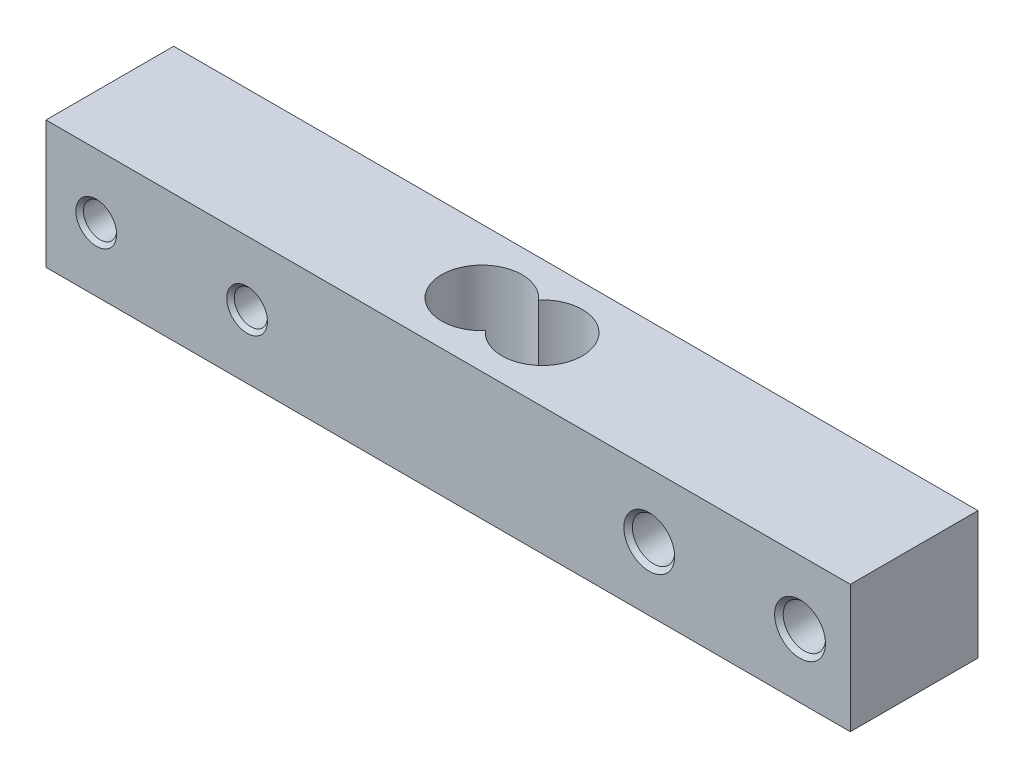
ISO-10303-21;
HEADER;
FILE_DESCRIPTION(('STEP AP214'),'2;1');
FILE_NAME('part.step','',(''),(''),'','','');
FILE_SCHEMA(('AUTOMOTIVE_DESIGN { 1 0 10303 214 1 1 1 1 }'));
ENDSEC;
DATA;
#1=APPLICATION_CONTEXT('core data for automotive mechanical design processes');
#2=APPLICATION_PROTOCOL_DEFINITION('international standard','automotive_design',2000,#1);
#3=PRODUCT_CONTEXT('',#1,'mechanical');
#4=PRODUCT('Part','Part','',(#3));
#5=PRODUCT_RELATED_PRODUCT_CATEGORY('part','',(#4));
#6=PRODUCT_DEFINITION_FORMATION('','',#4);
#7=PRODUCT_DEFINITION_CONTEXT('part definition',#1,'design');
#8=PRODUCT_DEFINITION('design','',#6,#7);
#9=PRODUCT_DEFINITION_SHAPE('','',#8);
#10=(LENGTH_UNIT() NAMED_UNIT(*) SI_UNIT(.MILLI.,.METRE.));
#11=(NAMED_UNIT(*) PLANE_ANGLE_UNIT() SI_UNIT($,.RADIAN.));
#12=(NAMED_UNIT(*) SI_UNIT($,.STERADIAN.) SOLID_ANGLE_UNIT());
#13=UNCERTAINTY_MEASURE_WITH_UNIT(LENGTH_MEASURE(1.E-05),#10,'distance_accuracy_value','');
#14=(GEOMETRIC_REPRESENTATION_CONTEXT(3) GLOBAL_UNCERTAINTY_ASSIGNED_CONTEXT((#13)) GLOBAL_UNIT_ASSIGNED_CONTEXT((#10,
#11,#12)) REPRESENTATION_CONTEXT('',''));
#15=CARTESIAN_POINT('',(0.,0.,0.));
#16=DIRECTION('',(0.,0.,1.));
#17=DIRECTION('',(1.,0.,0.));
#18=AXIS2_PLACEMENT_3D('',#15,#16,#17);
#19=CARTESIAN_POINT('',(40.,-6.35,12.7));
#20=DIRECTION('',(-1.,0.,0.));
#21=DIRECTION('',(0.,0.,1.));
#22=AXIS2_PLACEMENT_3D('',#19,#20,#21);
#23=PLANE('',#22);
#24=DIRECTION('',(0.,1.,0.));
#25=VECTOR('',#24,1.);
#26=CARTESIAN_POINT('',(40.,-6.35,0.));
#27=LINE('',#26,#25);
#28=CARTESIAN_POINT('',(40.,-6.35,0.));
#29=VERTEX_POINT('',#28);
#30=CARTESIAN_POINT('',(40.,6.35,0.));
#31=VERTEX_POINT('',#30);
#32=EDGE_CURVE('E134',#29,#31,#27,.T.);
#33=ORIENTED_EDGE('',*,*,#32,.T.);
#34=DIRECTION('',(0.,0.,-1.));
#35=VECTOR('',#34,1.);
#36=CARTESIAN_POINT('',(40.,6.35,12.7));
#37=LINE('',#36,#35);
#38=CARTESIAN_POINT('',(40.,6.35,12.7));
#39=VERTEX_POINT('',#38);
#40=EDGE_CURVE('E11',#39,#31,#37,.T.);
#41=ORIENTED_EDGE('',*,*,#40,.F.);
#42=DIRECTION('',(0.,1.,0.));
#43=VECTOR('',#42,1.);
#44=CARTESIAN_POINT('',(40.,-6.35,12.7));
#45=LINE('',#44,#43);
#46=CARTESIAN_POINT('',(40.,-6.35,12.7));
#47=VERTEX_POINT('',#46);
#48=EDGE_CURVE('E135',#47,#39,#45,.T.);
#49=ORIENTED_EDGE('',*,*,#48,.F.);
#50=DIRECTION('',(0.,0.,-1.));
#51=VECTOR('',#50,1.);
#52=CARTESIAN_POINT('',(40.,-6.35,12.7));
#53=LINE('',#52,#51);
#54=EDGE_CURVE('E145',#47,#29,#53,.T.);
#55=ORIENTED_EDGE('',*,*,#54,.T.);
#56=EDGE_LOOP('',(#33,#41,#49,#55));
#57=FACE_BOUND('',#56,.T.);
#58=ADVANCED_FACE('F42',(#57),#23,.F.);
#59=CARTESIAN_POINT('',(-40.,6.35,12.7));
#60=DIRECTION('',(0.,-1.,0.));
#61=DIRECTION('',(0.,0.,-1.));
#62=AXIS2_PLACEMENT_3D('',#59,#60,#61);
#63=PLANE('',#62);
#64=CARTESIAN_POINT('',(-3.,6.35,6.35));
#65=DIRECTION('',(0.,1.,0.));
#66=DIRECTION('',(0.,0.,1.));
#67=AXIS2_PLACEMENT_3D('',#64,#65,#66);
#68=CIRCLE('',#67,4.);
#69=CARTESIAN_POINT('',(0.,6.35,3.70424868893541));
#70=VERTEX_POINT('',#69);
#71=CARTESIAN_POINT('',(0.,6.35,8.99575131106459));
#72=VERTEX_POINT('',#71);
#73=EDGE_CURVE('E100',#70,#72,#68,.T.);
#74=ORIENTED_EDGE('',*,*,#73,.F.);
#75=CARTESIAN_POINT('',(3.,6.35,6.35));
#76=DIRECTION('',(0.,1.,0.));
#77=DIRECTION('',(0.,0.,1.));
#78=AXIS2_PLACEMENT_3D('',#75,#76,#77);
#79=CIRCLE('',#78,4.);
#80=EDGE_CURVE('E56',#72,#70,#79,.T.);
#81=ORIENTED_EDGE('',*,*,#80,.F.);
#82=EDGE_LOOP('',(#74,#81));
#83=FACE_BOUND('',#82,.T.);
#84=DIRECTION('',(-1.,0.,0.));
#85=VECTOR('',#84,1.);
#86=CARTESIAN_POINT('',(-40.,6.35,0.));
#87=LINE('',#86,#85);
#88=CARTESIAN_POINT('',(-40.,6.35,0.));
#89=VERTEX_POINT('',#88);
#90=EDGE_CURVE('E148',#31,#89,#87,.T.);
#91=ORIENTED_EDGE('',*,*,#90,.T.);
#92=DIRECTION('',(0.,0.,-1.));
#93=VECTOR('',#92,1.);
#94=CARTESIAN_POINT('',(-40.,6.35,12.7));
#95=LINE('',#94,#93);
#96=CARTESIAN_POINT('',(-40.,6.35,12.7));
#97=VERTEX_POINT('',#96);
#98=EDGE_CURVE('E49',#97,#89,#95,.T.);
#99=ORIENTED_EDGE('',*,*,#98,.F.);
#100=DIRECTION('',(-1.,0.,0.));
#101=VECTOR('',#100,1.);
#102=CARTESIAN_POINT('',(-40.,6.35,12.7));
#103=LINE('',#102,#101);
#104=EDGE_CURVE('E138',#39,#97,#103,.T.);
#105=ORIENTED_EDGE('',*,*,#104,.F.);
#106=ORIENTED_EDGE('',*,*,#40,.T.);
#107=EDGE_LOOP('',(#91,#99,#105,#106));
#108=FACE_BOUND('',#107,.T.);
#109=ADVANCED_FACE('F104',(#83,#108),#63,.F.);
#110=CARTESIAN_POINT('',(-40.,-6.35,12.7));
#111=DIRECTION('',(1.,0.,0.));
#112=DIRECTION('',(0.,0.,-1.));
#113=AXIS2_PLACEMENT_3D('',#110,#111,#112);
#114=PLANE('',#113);
#115=DIRECTION('',(0.,-1.,0.));
#116=VECTOR('',#115,1.);
#117=CARTESIAN_POINT('',(-40.,-6.35,0.));
#118=LINE('',#117,#116);
#119=CARTESIAN_POINT('',(-40.,-6.35,0.));
#120=VERTEX_POINT('',#119);
#121=EDGE_CURVE('E150',#89,#120,#118,.T.);
#122=ORIENTED_EDGE('',*,*,#121,.T.);
#123=DIRECTION('',(0.,0.,-1.));
#124=VECTOR('',#123,1.);
#125=CARTESIAN_POINT('',(-40.,-6.35,12.7));
#126=LINE('',#125,#124);
#127=CARTESIAN_POINT('',(-40.,-6.35,12.7));
#128=VERTEX_POINT('',#127);
#129=EDGE_CURVE('E155',#128,#120,#126,.T.);
#130=ORIENTED_EDGE('',*,*,#129,.F.);
#131=DIRECTION('',(0.,-1.,0.));
#132=VECTOR('',#131,1.);
#133=CARTESIAN_POINT('',(-40.,-6.35,12.7));
#134=LINE('',#133,#132);
#135=EDGE_CURVE('E141',#97,#128,#134,.T.);
#136=ORIENTED_EDGE('',*,*,#135,.F.);
#137=ORIENTED_EDGE('',*,*,#98,.T.);
#138=EDGE_LOOP('',(#122,#130,#136,#137));
#139=FACE_BOUND('',#138,.T.);
#140=ADVANCED_FACE('F162',(#139),#114,.F.);
#141=CARTESIAN_POINT('',(-40.,-6.35,12.7));
#142=DIRECTION('',(0.,1.,0.));
#143=DIRECTION('',(0.,0.,1.));
#144=AXIS2_PLACEMENT_3D('',#141,#142,#143);
#145=PLANE('',#144);
#146=CARTESIAN_POINT('',(-3.,-6.35,6.35));
#147=DIRECTION('',(0.,1.,0.));
#148=DIRECTION('',(0.,0.,1.));
#149=AXIS2_PLACEMENT_3D('',#146,#147,#148);
#150=CIRCLE('',#149,4.);
#151=CARTESIAN_POINT('',(0.,-6.35,3.70424868893541));
#152=VERTEX_POINT('',#151);
#153=CARTESIAN_POINT('',(0.,-6.35,8.99575131106459));
#154=VERTEX_POINT('',#153);
#155=EDGE_CURVE('E114',#152,#154,#150,.T.);
#156=ORIENTED_EDGE('',*,*,#155,.T.);
#157=CARTESIAN_POINT('',(3.,-6.35,6.35));
#158=DIRECTION('',(0.,1.,0.));
#159=DIRECTION('',(0.,0.,1.));
#160=AXIS2_PLACEMENT_3D('',#157,#158,#159);
#161=CIRCLE('',#160,4.);
#162=EDGE_CURVE('E61',#154,#152,#161,.T.);
#163=ORIENTED_EDGE('',*,*,#162,.T.);
#164=EDGE_LOOP('',(#156,#163));
#165=FACE_BOUND('',#164,.T.);
#166=DIRECTION('',(1.,0.,0.));
#167=VECTOR('',#166,1.);
#168=CARTESIAN_POINT('',(-40.,-6.35,0.));
#169=LINE('',#168,#167);
#170=EDGE_CURVE('E139',#120,#29,#169,.T.);
#171=ORIENTED_EDGE('',*,*,#170,.T.);
#172=ORIENTED_EDGE('',*,*,#54,.F.);
#173=DIRECTION('',(1.,0.,0.));
#174=VECTOR('',#173,1.);
#175=CARTESIAN_POINT('',(-40.,-6.35,12.7));
#176=LINE('',#175,#174);
#177=EDGE_CURVE('E143',#128,#47,#176,.T.);
#178=ORIENTED_EDGE('',*,*,#177,.F.);
#179=ORIENTED_EDGE('',*,*,#129,.T.);
#180=EDGE_LOOP('',(#171,#172,#178,#179));
#181=FACE_BOUND('',#180,.T.);
#182=ADVANCED_FACE('F170',(#165,#181),#145,.F.);
#183=CARTESIAN_POINT('',(0.,0.,12.7));
#184=DIRECTION('',(0.,0.,-1.));
#185=DIRECTION('',(-1.,0.,0.));
#186=AXIS2_PLACEMENT_3D('',#183,#184,#185);
#187=PLANE('',#186);
#188=CARTESIAN_POINT('',(20.,0.,12.7));
#189=DIRECTION('',(0.,0.,1.));
#190=DIRECTION('',(1.,0.,0.));
#191=AXIS2_PLACEMENT_3D('',#188,#189,#190);
#192=CIRCLE('',#191,2.525);
#193=CARTESIAN_POINT('',(22.525,0.,12.7));
#194=VERTEX_POINT('',#193);
#195=EDGE_CURVE('E236',#194,#194,#192,.T.);
#196=ORIENTED_EDGE('',*,*,#195,.F.);
#197=EDGE_LOOP('',(#196));
#198=FACE_BOUND('',#197,.T.);
#199=CARTESIAN_POINT('',(35.,0.,12.7));
#200=DIRECTION('',(0.,0.,1.));
#201=DIRECTION('',(1.,0.,0.));
#202=AXIS2_PLACEMENT_3D('',#199,#200,#201);
#203=CIRCLE('',#202,2.525);
#204=CARTESIAN_POINT('',(37.525,0.,12.7));
#205=VERTEX_POINT('',#204);
#206=EDGE_CURVE('E243',#205,#205,#203,.T.);
#207=ORIENTED_EDGE('',*,*,#206,.F.);
#208=EDGE_LOOP('',(#207));
#209=FACE_BOUND('',#208,.T.);
#210=CARTESIAN_POINT('',(-35.,0.,12.7));
#211=DIRECTION('',(0.,0.,1.));
#212=DIRECTION('',(1.,0.,0.));
#213=AXIS2_PLACEMENT_3D('',#210,#211,#212);
#214=CIRCLE('',#213,2.025);
#215=CARTESIAN_POINT('',(-32.975,0.,12.7));
#216=VERTEX_POINT('',#215);
#217=EDGE_CURVE('E96',#216,#216,#214,.T.);
#218=ORIENTED_EDGE('',*,*,#217,.F.);
#219=EDGE_LOOP('',(#218));
#220=FACE_BOUND('',#219,.T.);
#221=CARTESIAN_POINT('',(-20.,0.,12.7));
#222=DIRECTION('',(0.,0.,1.));
#223=DIRECTION('',(1.,0.,0.));
#224=AXIS2_PLACEMENT_3D('',#221,#222,#223);
#225=CIRCLE('',#224,2.025);
#226=CARTESIAN_POINT('',(-17.975,0.,12.7));
#227=VERTEX_POINT('',#226);
#228=EDGE_CURVE('E125',#227,#227,#225,.T.);
#229=ORIENTED_EDGE('',*,*,#228,.F.);
#230=EDGE_LOOP('',(#229));
#231=FACE_BOUND('',#230,.T.);
#232=ORIENTED_EDGE('',*,*,#48,.T.);
#233=ORIENTED_EDGE('',*,*,#104,.T.);
#234=ORIENTED_EDGE('',*,*,#135,.T.);
#235=ORIENTED_EDGE('',*,*,#177,.T.);
#236=EDGE_LOOP('',(#232,#233,#234,#235));
#237=FACE_BOUND('',#236,.T.);
#238=ADVANCED_FACE('F176',(#198,#209,#220,#231,#237),#187,.F.);
#239=CARTESIAN_POINT('',(0.,0.,0.));
#240=DIRECTION('',(0.,0.,-1.));
#241=DIRECTION('',(-1.,0.,0.));
#242=AXIS2_PLACEMENT_3D('',#239,#240,#241);
#243=PLANE('',#242);
#244=CARTESIAN_POINT('',(20.,0.,0.));
#245=DIRECTION('',(0.,0.,1.));
#246=DIRECTION('',(1.,0.,0.));
#247=AXIS2_PLACEMENT_3D('',#244,#245,#246);
#248=CIRCLE('',#247,2.1);
#249=CARTESIAN_POINT('',(22.1,0.,0.));
#250=VERTEX_POINT('',#249);
#251=EDGE_CURVE('E238',#250,#250,#248,.T.);
#252=ORIENTED_EDGE('',*,*,#251,.T.);
#253=EDGE_LOOP('',(#252));
#254=FACE_BOUND('',#253,.T.);
#255=CARTESIAN_POINT('',(35.,0.,0.));
#256=DIRECTION('',(0.,0.,1.));
#257=DIRECTION('',(1.,0.,0.));
#258=AXIS2_PLACEMENT_3D('',#255,#256,#257);
#259=CIRCLE('',#258,2.1);
#260=CARTESIAN_POINT('',(37.1,0.,0.));
#261=VERTEX_POINT('',#260);
#262=EDGE_CURVE('E106',#261,#261,#259,.T.);
#263=ORIENTED_EDGE('',*,*,#262,.T.);
#264=EDGE_LOOP('',(#263));
#265=FACE_BOUND('',#264,.T.);
#266=CARTESIAN_POINT('',(-35.,0.,0.));
#267=DIRECTION('',(0.,0.,1.));
#268=DIRECTION('',(1.,0.,0.));
#269=AXIS2_PLACEMENT_3D('',#266,#267,#268);
#270=CIRCLE('',#269,1.65);
#271=CARTESIAN_POINT('',(-33.35,0.,0.));
#272=VERTEX_POINT('',#271);
#273=EDGE_CURVE('E122',#272,#272,#270,.T.);
#274=ORIENTED_EDGE('',*,*,#273,.T.);
#275=EDGE_LOOP('',(#274));
#276=FACE_BOUND('',#275,.T.);
#277=CARTESIAN_POINT('',(-20.,0.,0.));
#278=DIRECTION('',(0.,0.,1.));
#279=DIRECTION('',(1.,0.,0.));
#280=AXIS2_PLACEMENT_3D('',#277,#278,#279);
#281=CIRCLE('',#280,1.65);
#282=CARTESIAN_POINT('',(-18.35,0.,0.));
#283=VERTEX_POINT('',#282);
#284=EDGE_CURVE('E131',#283,#283,#281,.T.);
#285=ORIENTED_EDGE('',*,*,#284,.T.);
#286=EDGE_LOOP('',(#285));
#287=FACE_BOUND('',#286,.T.);
#288=ORIENTED_EDGE('',*,*,#32,.F.);
#289=ORIENTED_EDGE('',*,*,#170,.F.);
#290=ORIENTED_EDGE('',*,*,#121,.F.);
#291=ORIENTED_EDGE('',*,*,#90,.F.);
#292=EDGE_LOOP('',(#288,#289,#290,#291));
#293=FACE_BOUND('',#292,.T.);
#294=ADVANCED_FACE('F167',(#254,#265,#276,#287,#293),#243,.T.);
#295=CARTESIAN_POINT('',(-20.,0.,12.7));
#296=DIRECTION('',(0.,0.,1.));
#297=DIRECTION('',(1.,0.,0.));
#298=AXIS2_PLACEMENT_3D('',#295,#296,#297);
#299=CYLINDRICAL_SURFACE('',#298,1.65);
#300=ORIENTED_EDGE('',*,*,#284,.F.);
#301=EDGE_LOOP('',(#300));
#302=FACE_BOUND('',#301,.T.);
#303=CARTESIAN_POINT('',(-20.,0.,12.325));
#304=DIRECTION('',(0.,0.,1.));
#305=DIRECTION('',(1.,0.,0.));
#306=AXIS2_PLACEMENT_3D('',#303,#304,#305);
#307=CIRCLE('',#306,1.65);
#308=CARTESIAN_POINT('',(-18.35,0.,12.325));
#309=VERTEX_POINT('',#308);
#310=EDGE_CURVE('E128',#309,#309,#307,.T.);
#311=ORIENTED_EDGE('',*,*,#310,.T.);
#312=EDGE_LOOP('',(#311));
#313=FACE_BOUND('',#312,.T.);
#314=ADVANCED_FACE('F189',(#302,#313),#299,.F.);
#315=CARTESIAN_POINT('',(-20.,0.,12.7));
#316=DIRECTION('',(0.,0.,1.));
#317=DIRECTION('',(1.,0.,0.));
#318=AXIS2_PLACEMENT_3D('',#315,#316,#317);
#319=CONICAL_SURFACE('',#318,2.025,0.785398163397446);
#320=ORIENTED_EDGE('',*,*,#310,.F.);
#321=EDGE_LOOP('',(#320));
#322=FACE_BOUND('',#321,.T.);
#323=ORIENTED_EDGE('',*,*,#228,.T.);
#324=EDGE_LOOP('',(#323));
#325=FACE_BOUND('',#324,.T.);
#326=ADVANCED_FACE('F196',(#322,#325),#319,.F.);
#327=CARTESIAN_POINT('',(-35.,0.,12.7));
#328=DIRECTION('',(0.,0.,1.));
#329=DIRECTION('',(1.,0.,0.));
#330=AXIS2_PLACEMENT_3D('',#327,#328,#329);
#331=CYLINDRICAL_SURFACE('',#330,1.65);
#332=ORIENTED_EDGE('',*,*,#273,.F.);
#333=EDGE_LOOP('',(#332));
#334=FACE_BOUND('',#333,.T.);
#335=CARTESIAN_POINT('',(-35.,0.,12.325));
#336=DIRECTION('',(0.,0.,1.));
#337=DIRECTION('',(1.,0.,0.));
#338=AXIS2_PLACEMENT_3D('',#335,#336,#337);
#339=CIRCLE('',#338,1.65);
#340=CARTESIAN_POINT('',(-33.35,0.,12.325));
#341=VERTEX_POINT('',#340);
#342=EDGE_CURVE('E119',#341,#341,#339,.T.);
#343=ORIENTED_EDGE('',*,*,#342,.T.);
#344=EDGE_LOOP('',(#343));
#345=FACE_BOUND('',#344,.T.);
#346=ADVANCED_FACE('F200',(#334,#345),#331,.F.);
#347=CARTESIAN_POINT('',(-35.,0.,12.7));
#348=DIRECTION('',(0.,0.,1.));
#349=DIRECTION('',(1.,0.,0.));
#350=AXIS2_PLACEMENT_3D('',#347,#348,#349);
#351=CONICAL_SURFACE('',#350,2.025,0.785398163397446);
#352=ORIENTED_EDGE('',*,*,#342,.F.);
#353=EDGE_LOOP('',(#352));
#354=FACE_BOUND('',#353,.T.);
#355=ORIENTED_EDGE('',*,*,#217,.T.);
#356=EDGE_LOOP('',(#355));
#357=FACE_BOUND('',#356,.T.);
#358=ADVANCED_FACE('F204',(#354,#357),#351,.F.);
#359=CARTESIAN_POINT('',(3.,-6.35,6.35));
#360=DIRECTION('',(0.,1.,0.));
#361=DIRECTION('',(0.,0.,1.));
#362=AXIS2_PLACEMENT_3D('',#359,#360,#361);
#363=CYLINDRICAL_SURFACE('',#362,4.);
#364=DIRECTION('',(0.,1.,0.));
#365=VECTOR('',#364,1.);
#366=CARTESIAN_POINT('',(0.,-6.35,3.70424868893541));
#367=LINE('',#366,#365);
#368=EDGE_CURVE('E97',#152,#70,#367,.T.);
#369=ORIENTED_EDGE('',*,*,#368,.F.);
#370=ORIENTED_EDGE('',*,*,#162,.F.);
#371=DIRECTION('',(0.,1.,0.));
#372=VECTOR('',#371,1.);
#373=CARTESIAN_POINT('',(0.,-6.35,8.99575131106459));
#374=LINE('',#373,#372);
#375=EDGE_CURVE('E90',#154,#72,#374,.T.);
#376=ORIENTED_EDGE('',*,*,#375,.T.);
#377=ORIENTED_EDGE('',*,*,#80,.T.);
#378=EDGE_LOOP('',(#369,#370,#376,#377));
#379=FACE_BOUND('',#378,.T.);
#380=ADVANCED_FACE('F92',(#379),#363,.F.);
#381=CARTESIAN_POINT('',(-3.,-6.35,6.35));
#382=DIRECTION('',(0.,1.,0.));
#383=DIRECTION('',(0.,0.,1.));
#384=AXIS2_PLACEMENT_3D('',#381,#382,#383);
#385=CYLINDRICAL_SURFACE('',#384,4.);
#386=ORIENTED_EDGE('',*,*,#375,.F.);
#387=ORIENTED_EDGE('',*,*,#155,.F.);
#388=ORIENTED_EDGE('',*,*,#368,.T.);
#389=ORIENTED_EDGE('',*,*,#73,.T.);
#390=EDGE_LOOP('',(#386,#387,#388,#389));
#391=FACE_BOUND('',#390,.T.);
#392=ADVANCED_FACE('F101',(#391),#385,.F.);
#393=CARTESIAN_POINT('',(35.,0.,12.7));
#394=DIRECTION('',(0.,0.,1.));
#395=DIRECTION('',(1.,0.,0.));
#396=AXIS2_PLACEMENT_3D('',#393,#394,#395);
#397=CYLINDRICAL_SURFACE('',#396,2.1);
#398=ORIENTED_EDGE('',*,*,#262,.F.);
#399=EDGE_LOOP('',(#398));
#400=FACE_BOUND('',#399,.T.);
#401=CARTESIAN_POINT('',(35.,0.,12.275));
#402=DIRECTION('',(0.,0.,1.));
#403=DIRECTION('',(1.,0.,0.));
#404=AXIS2_PLACEMENT_3D('',#401,#402,#403);
#405=CIRCLE('',#404,2.1);
#406=CARTESIAN_POINT('',(37.1,0.,12.275));
#407=VERTEX_POINT('',#406);
#408=EDGE_CURVE('E109',#407,#407,#405,.T.);
#409=ORIENTED_EDGE('',*,*,#408,.T.);
#410=EDGE_LOOP('',(#409));
#411=FACE_BOUND('',#410,.T.);
#412=ADVANCED_FACE('F213',(#400,#411),#397,.F.);
#413=CARTESIAN_POINT('',(35.,0.,12.7));
#414=DIRECTION('',(0.,0.,1.));
#415=DIRECTION('',(1.,0.,0.));
#416=AXIS2_PLACEMENT_3D('',#413,#414,#415);
#417=CONICAL_SURFACE('',#416,2.525,0.785398163397448);
#418=ORIENTED_EDGE('',*,*,#408,.F.);
#419=EDGE_LOOP('',(#418));
#420=FACE_BOUND('',#419,.T.);
#421=ORIENTED_EDGE('',*,*,#206,.T.);
#422=EDGE_LOOP('',(#421));
#423=FACE_BOUND('',#422,.T.);
#424=ADVANCED_FACE('F216',(#420,#423),#417,.F.);
#425=CARTESIAN_POINT('',(20.,0.,12.7));
#426=DIRECTION('',(0.,0.,1.));
#427=DIRECTION('',(1.,0.,0.));
#428=AXIS2_PLACEMENT_3D('',#425,#426,#427);
#429=CYLINDRICAL_SURFACE('',#428,2.1);
#430=ORIENTED_EDGE('',*,*,#251,.F.);
#431=EDGE_LOOP('',(#430));
#432=FACE_BOUND('',#431,.T.);
#433=CARTESIAN_POINT('',(20.,0.,12.275));
#434=DIRECTION('',(0.,0.,1.));
#435=DIRECTION('',(1.,0.,0.));
#436=AXIS2_PLACEMENT_3D('',#433,#434,#435);
#437=CIRCLE('',#436,2.1);
#438=CARTESIAN_POINT('',(22.1,0.,12.275));
#439=VERTEX_POINT('',#438);
#440=EDGE_CURVE('E233',#439,#439,#437,.T.);
#441=ORIENTED_EDGE('',*,*,#440,.T.);
#442=EDGE_LOOP('',(#441));
#443=FACE_BOUND('',#442,.T.);
#444=ADVANCED_FACE('F220',(#432,#443),#429,.F.);
#445=CARTESIAN_POINT('',(20.,0.,12.7));
#446=DIRECTION('',(0.,0.,1.));
#447=DIRECTION('',(1.,0.,0.));
#448=AXIS2_PLACEMENT_3D('',#445,#446,#447);
#449=CONICAL_SURFACE('',#448,2.525,0.785398163397448);
#450=ORIENTED_EDGE('',*,*,#440,.F.);
#451=EDGE_LOOP('',(#450));
#452=FACE_BOUND('',#451,.T.);
#453=ORIENTED_EDGE('',*,*,#195,.T.);
#454=EDGE_LOOP('',(#453));
#455=FACE_BOUND('',#454,.T.);
#456=ADVANCED_FACE('F224',(#452,#455),#449,.F.);
#457=CLOSED_SHELL('',(#58,#109,#140,#182,#238,#294,#314,#326,#346,#358,#380,#392,#412,#424,#444,#456));
#458=MANIFOLD_SOLID_BREP('B2',#457);
#459=ADVANCED_BREP_SHAPE_REPRESENTATION('',(#18,#458),#14);
#460=SHAPE_DEFINITION_REPRESENTATION(#9,#459);
ENDSEC;
END-ISO-10303-21;
